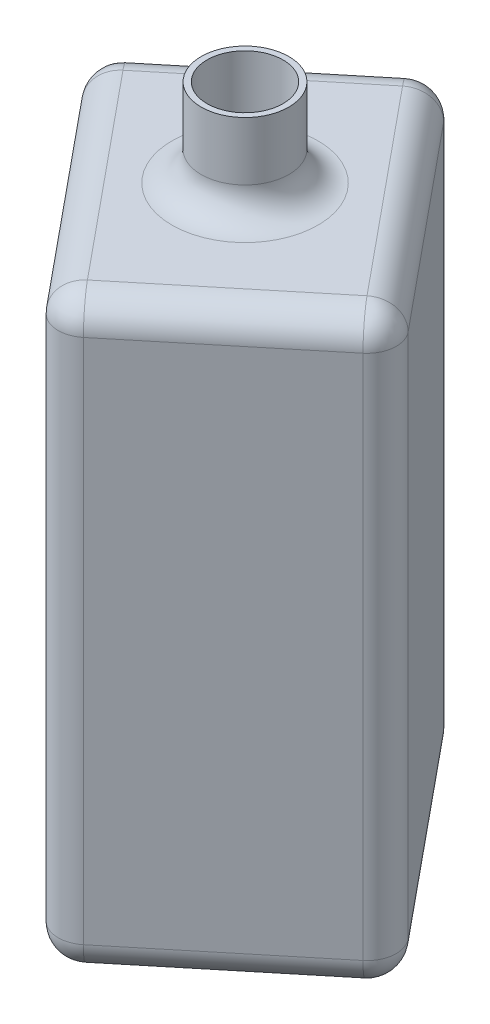
ISO-10303-21;
HEADER;
FILE_DESCRIPTION(('STEP AP214'),'2;1');
FILE_NAME('part.step','',(''),(''),'','','');
FILE_SCHEMA(('AUTOMOTIVE_DESIGN { 1 0 10303 214 1 1 1 1 }'));
ENDSEC;
DATA;
#1=APPLICATION_CONTEXT('core data for automotive mechanical design processes');
#2=APPLICATION_PROTOCOL_DEFINITION('international standard','automotive_design',2000,#1);
#3=PRODUCT_CONTEXT('',#1,'mechanical');
#4=PRODUCT('Part','Part','',(#3));
#5=PRODUCT_RELATED_PRODUCT_CATEGORY('part','',(#4));
#6=PRODUCT_DEFINITION_FORMATION('','',#4);
#7=PRODUCT_DEFINITION_CONTEXT('part definition',#1,'design');
#8=PRODUCT_DEFINITION('design','',#6,#7);
#9=PRODUCT_DEFINITION_SHAPE('','',#8);
#10=(LENGTH_UNIT() NAMED_UNIT(*) SI_UNIT(.MILLI.,.METRE.));
#11=(NAMED_UNIT(*) PLANE_ANGLE_UNIT() SI_UNIT($,.RADIAN.));
#12=(NAMED_UNIT(*) SI_UNIT($,.STERADIAN.) SOLID_ANGLE_UNIT());
#13=UNCERTAINTY_MEASURE_WITH_UNIT(LENGTH_MEASURE(1.E-05),#10,'distance_accuracy_value','');
#14=(GEOMETRIC_REPRESENTATION_CONTEXT(3) GLOBAL_UNCERTAINTY_ASSIGNED_CONTEXT((#13)) GLOBAL_UNIT_ASSIGNED_CONTEXT((#10,
#11,#12)) REPRESENTATION_CONTEXT('',''));
#15=CARTESIAN_POINT('',(0.,0.,0.));
#16=DIRECTION('',(0.,0.,1.));
#17=DIRECTION('',(1.,0.,0.));
#18=AXIS2_PLACEMENT_3D('',#15,#16,#17);
#19=CARTESIAN_POINT('',(0.,210.,0.));
#20=DIRECTION('',(0.,1.,0.));
#21=DIRECTION('',(0.,0.,1.));
#22=AXIS2_PLACEMENT_3D('',#19,#20,#21);
#23=TOROIDAL_SURFACE('',#22,25.,10.);
#24=CARTESIAN_POINT('',(0.,210.,0.));
#25=DIRECTION('',(0.,1.,0.));
#26=DIRECTION('',(0.,0.,1.));
#27=AXIS2_PLACEMENT_3D('',#24,#25,#26);
#28=CIRCLE('',#27,15.);
#29=CARTESIAN_POINT('',(0.,210.,15.));
#30=VERTEX_POINT('',#29);
#31=EDGE_CURVE('E193',#30,#30,#28,.T.);
#32=ORIENTED_EDGE('',*,*,#31,.F.);
#33=EDGE_LOOP('',(#32));
#34=FACE_BOUND('',#33,.T.);
#35=CARTESIAN_POINT('',(0.,200.,0.));
#36=DIRECTION('',(0.,1.,0.));
#37=DIRECTION('',(0.,0.,1.));
#38=AXIS2_PLACEMENT_3D('',#35,#36,#37);
#39=CIRCLE('',#38,25.);
#40=CARTESIAN_POINT('',(0.,200.,25.));
#41=VERTEX_POINT('',#40);
#42=EDGE_CURVE('E201',#41,#41,#39,.F.);
#43=ORIENTED_EDGE('',*,*,#42,.F.);
#44=EDGE_LOOP('',(#43));
#45=FACE_BOUND('',#44,.T.);
#46=ADVANCED_FACE('F52',(#34,#45),#23,.F.);
#47=CARTESIAN_POINT('',(0.,200.,0.));
#48=DIRECTION('',(0.,1.,0.));
#49=DIRECTION('',(0.,0.,1.));
#50=AXIS2_PLACEMENT_3D('',#47,#48,#49);
#51=PLANE('',#50);
#52=DIRECTION('',(0.634919137830926,0.,0.772578596918161));
#53=VECTOR('',#52,1.);
#54=CARTESIAN_POINT('',(8.13213694383848,200.,63.438433055451));
#55=LINE('',#54,#53);
#56=CARTESIAN_POINT('',(-54.3114300765985,200.,-12.5437834517178));
#57=VERTEX_POINT('',#56);
#58=CARTESIAN_POINT('',(1.78294556552921,200.,55.7126470862694));
#59=VERTEX_POINT('',#58);
#60=EDGE_CURVE('E62',#57,#59,#55,.T.);
#61=ORIENTED_EDGE('',*,*,#60,.T.);
#62=DIRECTION('',(0.772578596918161,0.,-0.634919137830925));
#63=VECTOR('',#62,1.);
#64=CARTESIAN_POINT('',(62.0372160457801,200.,6.19459207340861));
#65=LINE('',#64,#63);
#66=CARTESIAN_POINT('',(54.3114300765985,200.,12.5437834517179));
#67=VERTEX_POINT('',#66);
#68=EDGE_CURVE('E11',#59,#67,#65,.T.);
#69=ORIENTED_EDGE('',*,*,#68,.T.);
#70=DIRECTION('',(-0.634919137830926,0.,-0.772578596918161));
#71=VECTOR('',#70,1.);
#72=CARTESIAN_POINT('',(-8.13213694383851,200.,-63.438433055451));
#73=LINE('',#72,#71);
#74=CARTESIAN_POINT('',(-1.78294556552925,200.,-55.7126470862694));
#75=VERTEX_POINT('',#74);
#76=EDGE_CURVE('E249',#67,#75,#73,.T.);
#77=ORIENTED_EDGE('',*,*,#76,.T.);
#78=DIRECTION('',(-0.772578596918161,0.,0.634919137830926));
#79=VECTOR('',#78,1.);
#80=CARTESIAN_POINT('',(-62.0372160457801,200.,-6.19459207340857));
#81=LINE('',#80,#79);
#82=EDGE_CURVE('E73',#75,#57,#81,.T.);
#83=ORIENTED_EDGE('',*,*,#82,.T.);
#84=EDGE_LOOP('',(#61,#69,#77,#83));
#85=FACE_BOUND('',#84,.T.);
#86=ORIENTED_EDGE('',*,*,#42,.T.);
#87=EDGE_LOOP('',(#86));
#88=FACE_BOUND('',#87,.T.);
#89=ADVANCED_FACE('F369',(#85,#88),#51,.T.);
#90=CARTESIAN_POINT('',(0.,0.,0.));
#91=DIRECTION('',(0.,1.,0.));
#92=DIRECTION('',(0.,0.,1.));
#93=AXIS2_PLACEMENT_3D('',#90,#91,#92);
#94=PLANE('',#93);
#95=DIRECTION('',(0.772578596918161,0.,-0.634919137830925));
#96=VECTOR('',#95,1.);
#97=CARTESIAN_POINT('',(28.0471878210639,0.,34.1282152689936));
#98=LINE('',#97,#96);
#99=CARTESIAN_POINT('',(54.3114300765985,0.,12.5437834517179));
#100=VERTEX_POINT('',#99);
#101=CARTESIAN_POINT('',(1.78294556552923,0.,55.7126470862694));
#102=VERTEX_POINT('',#101);
#103=EDGE_CURVE('E215',#100,#102,#98,.F.);
#104=ORIENTED_EDGE('',*,*,#103,.T.);
#105=DIRECTION('',(0.634919137830926,0.,0.772578596918161));
#106=VECTOR('',#105,1.);
#107=CARTESIAN_POINT('',(-26.2642422555347,0.,21.5844318172758));
#108=LINE('',#107,#106);
#109=CARTESIAN_POINT('',(-54.3114300765985,0.,-12.5437834517178));
#110=VERTEX_POINT('',#109);
#111=EDGE_CURVE('E219',#102,#110,#108,.F.);
#112=ORIENTED_EDGE('',*,*,#111,.T.);
#113=DIRECTION('',(-0.772578596918161,0.,0.634919137830926));
#114=VECTOR('',#113,1.);
#115=CARTESIAN_POINT('',(-28.0471878210639,0.,-34.1282152689936));
#116=LINE('',#115,#114);
#117=CARTESIAN_POINT('',(-1.78294556552925,0.,-55.7126470862694));
#118=VERTEX_POINT('',#117);
#119=EDGE_CURVE('E217',#110,#118,#116,.F.);
#120=ORIENTED_EDGE('',*,*,#119,.T.);
#121=DIRECTION('',(-0.634919137830926,0.,-0.772578596918161));
#122=VECTOR('',#121,1.);
#123=CARTESIAN_POINT('',(26.2642422555346,0.,-21.5844318172758));
#124=LINE('',#123,#122);
#125=EDGE_CURVE('E213',#118,#100,#124,.F.);
#126=ORIENTED_EDGE('',*,*,#125,.T.);
#127=EDGE_LOOP('',(#104,#112,#120,#126));
#128=FACE_BOUND('',#127,.T.);
#129=ADVANCED_FACE('F372',(#128),#94,.F.);
#130=CARTESIAN_POINT('',(68.3864074240894,200.,13.9203780425902));
#131=DIRECTION('',(-0.772578596918161,0.,0.634919137830926));
#132=DIRECTION('',(0.634919137830926,0.,0.772578596918161));
#133=AXIS2_PLACEMENT_3D('',#130,#131,#132);
#134=PLANE('',#133);
#135=DIRECTION('',(0.,-1.,0.));
#136=VECTOR('',#135,1.);
#137=CARTESIAN_POINT('',(62.0372160457801,200.,6.19459207340861));
#138=LINE('',#137,#136);
#139=CARTESIAN_POINT('',(62.0372160457801,190.,6.19459207340861));
#140=VERTEX_POINT('',#139);
#141=CARTESIAN_POINT('',(62.0372160457801,10.,6.19459207340861));
#142=VERTEX_POINT('',#141);
#143=EDGE_CURVE('E244',#140,#142,#138,.T.);
#144=ORIENTED_EDGE('',*,*,#143,.T.);
#145=DIRECTION('',(-0.634919137830926,0.,-0.772578596918161));
#146=VECTOR('',#145,1.);
#147=CARTESIAN_POINT('',(68.3864074240894,10.,13.9203780425902));
#148=LINE('',#147,#146);
#149=CARTESIAN_POINT('',(5.94284040365236,10.,-62.0618384645786));
#150=VERTEX_POINT('',#149);
#151=EDGE_CURVE('E247',#142,#150,#148,.T.);
#152=ORIENTED_EDGE('',*,*,#151,.T.);
#153=DIRECTION('',(0.,-1.,0.));
#154=VECTOR('',#153,1.);
#155=CARTESIAN_POINT('',(5.94284040365237,200.,-62.0618384645786));
#156=LINE('',#155,#154);
#157=CARTESIAN_POINT('',(5.94284040365236,190.,-62.0618384645786));
#158=VERTEX_POINT('',#157);
#159=EDGE_CURVE('E242',#150,#158,#156,.F.);
#160=ORIENTED_EDGE('',*,*,#159,.T.);
#161=DIRECTION('',(-0.634919137830926,0.,-0.772578596918161));
#162=VECTOR('',#161,1.);
#163=CARTESIAN_POINT('',(68.3864074240894,190.,13.9203780425902));
#164=LINE('',#163,#162);
#165=EDGE_CURVE('E240',#158,#140,#164,.F.);
#166=ORIENTED_EDGE('',*,*,#165,.T.);
#167=EDGE_LOOP('',(#144,#152,#160,#166));
#168=FACE_BOUND('',#167,.T.);
#169=ADVANCED_FACE('F376',(#168),#134,.F.);
#170=CARTESIAN_POINT('',(-0.406350974656892,200.,-69.7876244337603));
#171=DIRECTION('',(0.634919137830926,0.,0.772578596918161));
#172=DIRECTION('',(0.772578596918161,0.,-0.634919137830926));
#173=AXIS2_PLACEMENT_3D('',#170,#171,#172);
#174=PLANE('',#173);
#175=DIRECTION('',(-0.772578596918161,0.,0.634919137830926));
#176=VECTOR('',#175,1.);
#177=CARTESIAN_POINT('',(-0.406350974656892,10.,-69.7876244337603));
#178=LINE('',#177,#176);
#179=CARTESIAN_POINT('',(-8.13213694383851,10.,-63.438433055451));
#180=VERTEX_POINT('',#179);
#181=CARTESIAN_POINT('',(-60.6606214549078,10.,-20.2695694208994));
#182=VERTEX_POINT('',#181);
#183=EDGE_CURVE('E226',#180,#182,#178,.T.);
#184=ORIENTED_EDGE('',*,*,#183,.T.);
#185=DIRECTION('',(0.,-1.,0.));
#186=VECTOR('',#185,1.);
#187=CARTESIAN_POINT('',(-60.6606214549078,200.,-20.2695694208995));
#188=LINE('',#187,#186);
#189=CARTESIAN_POINT('',(-60.6606214549078,190.,-20.2695694208994));
#190=VERTEX_POINT('',#189);
#191=EDGE_CURVE('E228',#182,#190,#188,.F.);
#192=ORIENTED_EDGE('',*,*,#191,.T.);
#193=DIRECTION('',(-0.772578596918161,0.,0.634919137830926));
#194=VECTOR('',#193,1.);
#195=CARTESIAN_POINT('',(-0.406350974656879,190.,-69.7876244337603));
#196=LINE('',#195,#194);
#197=CARTESIAN_POINT('',(-8.13213694383851,190.,-63.438433055451));
#198=VERTEX_POINT('',#197);
#199=EDGE_CURVE('E222',#190,#198,#196,.F.);
#200=ORIENTED_EDGE('',*,*,#199,.T.);
#201=DIRECTION('',(0.,-1.,0.));
#202=VECTOR('',#201,1.);
#203=CARTESIAN_POINT('',(-8.13213694383851,200.,-63.438433055451));
#204=LINE('',#203,#202);
#205=EDGE_CURVE('E224',#198,#180,#204,.T.);
#206=ORIENTED_EDGE('',*,*,#205,.T.);
#207=EDGE_LOOP('',(#184,#192,#200,#206));
#208=FACE_BOUND('',#207,.T.);
#209=ADVANCED_FACE('F386',(#208),#174,.F.);
#210=CARTESIAN_POINT('',(0.406350974656876,200.,69.7876244337603));
#211=DIRECTION('',(0.772578596918161,0.,-0.634919137830925));
#212=DIRECTION('',(-0.634919137830926,0.,-0.772578596918161));
#213=AXIS2_PLACEMENT_3D('',#210,#211,#212);
#214=PLANE('',#213);
#215=DIRECTION('',(0.,-1.,0.));
#216=VECTOR('',#215,1.);
#217=CARTESIAN_POINT('',(-62.0372160457801,200.,-6.19459207340861));
#218=LINE('',#217,#216);
#219=CARTESIAN_POINT('',(-62.0372160457801,190.,-6.19459207340859));
#220=VERTEX_POINT('',#219);
#221=CARTESIAN_POINT('',(-62.0372160457801,10.,-6.19459207340859));
#222=VERTEX_POINT('',#221);
#223=EDGE_CURVE('E208',#220,#222,#218,.T.);
#224=ORIENTED_EDGE('',*,*,#223,.T.);
#225=DIRECTION('',(0.634919137830926,0.,0.772578596918161));
#226=VECTOR('',#225,1.);
#227=CARTESIAN_POINT('',(0.406350974656876,10.,69.7876244337603));
#228=LINE('',#227,#226);
#229=CARTESIAN_POINT('',(-5.94284040365238,10.,62.0618384645787));
#230=VERTEX_POINT('',#229);
#231=EDGE_CURVE('E210',#222,#230,#228,.T.);
#232=ORIENTED_EDGE('',*,*,#231,.T.);
#233=DIRECTION('',(0.,-1.,0.));
#234=VECTOR('',#233,1.);
#235=CARTESIAN_POINT('',(-5.94284040365238,200.,62.0618384645787));
#236=LINE('',#235,#234);
#237=CARTESIAN_POINT('',(-5.94284040365238,190.,62.0618384645787));
#238=VERTEX_POINT('',#237);
#239=EDGE_CURVE('E206',#230,#238,#236,.F.);
#240=ORIENTED_EDGE('',*,*,#239,.T.);
#241=DIRECTION('',(0.634919137830926,0.,0.772578596918161));
#242=VECTOR('',#241,1.);
#243=CARTESIAN_POINT('',(-68.3864074240894,190.,-13.9203780425902));
#244=LINE('',#243,#242);
#245=EDGE_CURVE('E204',#238,#220,#244,.F.);
#246=ORIENTED_EDGE('',*,*,#245,.T.);
#247=EDGE_LOOP('',(#224,#232,#240,#246));
#248=FACE_BOUND('',#247,.T.);
#249=ADVANCED_FACE('F382',(#248),#214,.F.);
#250=CARTESIAN_POINT('',(68.3864074240894,200.,13.9203780425902));
#251=DIRECTION('',(-0.634919137830925,0.,-0.772578596918161));
#252=DIRECTION('',(-0.772578596918161,0.,0.634919137830925));
#253=AXIS2_PLACEMENT_3D('',#250,#251,#252);
#254=PLANE('',#253);
#255=DIRECTION('',(0.772578596918161,0.,-0.634919137830925));
#256=VECTOR('',#255,1.);
#257=CARTESIAN_POINT('',(0.406350974656869,190.,69.7876244337603));
#258=LINE('',#257,#256);
#259=CARTESIAN_POINT('',(60.6606214549078,190.,20.2695694208995));
#260=VERTEX_POINT('',#259);
#261=CARTESIAN_POINT('',(8.13213694383847,190.,63.438433055451));
#262=VERTEX_POINT('',#261);
#263=EDGE_CURVE('E231',#260,#262,#258,.F.);
#264=ORIENTED_EDGE('',*,*,#263,.T.);
#265=DIRECTION('',(0.,-1.,0.));
#266=VECTOR('',#265,1.);
#267=CARTESIAN_POINT('',(8.13213694383847,200.,63.438433055451));
#268=LINE('',#267,#266);
#269=CARTESIAN_POINT('',(8.13213694383847,10.,63.438433055451));
#270=VERTEX_POINT('',#269);
#271=EDGE_CURVE('E237',#262,#270,#268,.T.);
#272=ORIENTED_EDGE('',*,*,#271,.T.);
#273=DIRECTION('',(0.772578596918161,0.,-0.634919137830925));
#274=VECTOR('',#273,1.);
#275=CARTESIAN_POINT('',(68.3864074240894,10.,13.9203780425902));
#276=LINE('',#275,#274);
#277=CARTESIAN_POINT('',(60.6606214549078,10.,20.2695694208995));
#278=VERTEX_POINT('',#277);
#279=EDGE_CURVE('E235',#270,#278,#276,.T.);
#280=ORIENTED_EDGE('',*,*,#279,.T.);
#281=DIRECTION('',(0.,-1.,0.));
#282=VECTOR('',#281,1.);
#283=CARTESIAN_POINT('',(60.6606214549078,200.,20.2695694208995));
#284=LINE('',#283,#282);
#285=EDGE_CURVE('E233',#278,#260,#284,.F.);
#286=ORIENTED_EDGE('',*,*,#285,.T.);
#287=EDGE_LOOP('',(#264,#272,#280,#286));
#288=FACE_BOUND('',#287,.T.);
#289=ADVANCED_FACE('F378',(#288),#254,.F.);
#290=CARTESIAN_POINT('',(0.,230.,0.));
#291=DIRECTION('',(0.,1.,0.));
#292=DIRECTION('',(0.,0.,1.));
#293=AXIS2_PLACEMENT_3D('',#290,#291,#292);
#294=PLANE('',#293);
#295=CARTESIAN_POINT('',(0.,230.,0.));
#296=DIRECTION('',(0.,1.,0.));
#297=DIRECTION('',(0.,0.,1.));
#298=AXIS2_PLACEMENT_3D('',#295,#296,#297);
#299=CIRCLE('',#298,15.);
#300=CARTESIAN_POINT('',(0.,230.,15.));
#301=VERTEX_POINT('',#300);
#302=EDGE_CURVE('E185',#301,#301,#299,.T.);
#303=ORIENTED_EDGE('',*,*,#302,.T.);
#304=EDGE_LOOP('',(#303));
#305=FACE_BOUND('',#304,.T.);
#306=CARTESIAN_POINT('',(0.,230.,0.));
#307=DIRECTION('',(0.,1.,0.));
#308=DIRECTION('',(0.,0.,1.));
#309=AXIS2_PLACEMENT_3D('',#306,#307,#308);
#310=CIRCLE('',#309,13.);
#311=CARTESIAN_POINT('',(0.,230.,13.));
#312=VERTEX_POINT('',#311);
#313=EDGE_CURVE('E320',#312,#312,#310,.T.);
#314=ORIENTED_EDGE('',*,*,#313,.F.);
#315=EDGE_LOOP('',(#314));
#316=FACE_BOUND('',#315,.T.);
#317=ADVANCED_FACE('F381',(#305,#316),#294,.T.);
#318=CARTESIAN_POINT('',(0.,230.,0.));
#319=DIRECTION('',(0.,-1.,0.));
#320=DIRECTION('',(0.,0.,-1.));
#321=AXIS2_PLACEMENT_3D('',#318,#319,#320);
#322=CYLINDRICAL_SURFACE('',#321,15.);
#323=ORIENTED_EDGE('',*,*,#31,.T.);
#324=EDGE_LOOP('',(#323));
#325=FACE_BOUND('',#324,.T.);
#326=ORIENTED_EDGE('',*,*,#302,.F.);
#327=EDGE_LOOP('',(#326));
#328=FACE_BOUND('',#327,.T.);
#329=ADVANCED_FACE('F524',(#325,#328),#322,.T.);
#330=CARTESIAN_POINT('',(0.,230.,0.));
#331=DIRECTION('',(0.,-1.,0.));
#332=DIRECTION('',(0.,0.,-1.));
#333=AXIS2_PLACEMENT_3D('',#330,#331,#332);
#334=CYLINDRICAL_SURFACE('',#333,13.);
#335=ORIENTED_EDGE('',*,*,#313,.T.);
#336=EDGE_LOOP('',(#335));
#337=FACE_BOUND('',#336,.T.);
#338=CARTESIAN_POINT('',(0.,200.,0.));
#339=DIRECTION('',(0.,1.,0.));
#340=DIRECTION('',(0.,0.,1.));
#341=AXIS2_PLACEMENT_3D('',#338,#339,#340);
#342=CIRCLE('',#341,13.);
#343=CARTESIAN_POINT('',(0.,200.,13.));
#344=VERTEX_POINT('',#343);
#345=EDGE_CURVE('E190',#344,#344,#342,.F.);
#346=ORIENTED_EDGE('',*,*,#345,.T.);
#347=EDGE_LOOP('',(#346));
#348=FACE_BOUND('',#347,.T.);
#349=ADVANCED_FACE('F518',(#337,#348),#334,.F.);
#350=ORIENTED_EDGE('',*,*,#345,.F.);
#351=EDGE_LOOP('',(#350));
#352=FACE_BOUND('',#351,.T.);
#353=ADVANCED_FACE('F373',(#352),#51,.T.);
#354=CARTESIAN_POINT('',(26.2642422555346,190.,-21.5844318172758));
#355=DIRECTION('',(0.634919137830926,0.,0.772578596918161));
#356=DIRECTION('',(0.772578596918161,0.,-0.634919137830926));
#357=AXIS2_PLACEMENT_3D('',#354,#355,#356);
#358=CYLINDRICAL_SURFACE('',#357,10.);
#359=CARTESIAN_POINT('',(-1.78294556552925,190.,-55.7126470862694));
#360=DIRECTION('',(-0.634919137830925,0.,-0.772578596918161));
#361=DIRECTION('',(-0.772578596918161,0.,0.634919137830925));
#362=AXIS2_PLACEMENT_3D('',#359,#360,#361);
#363=CIRCLE('',#362,10.);
#364=EDGE_CURVE('E56',#75,#158,#363,.T.);
#365=ORIENTED_EDGE('',*,*,#364,.F.);
#366=ORIENTED_EDGE('',*,*,#76,.F.);
#367=CARTESIAN_POINT('',(54.3114300765985,190.,12.5437834517179));
#368=DIRECTION('',(0.634919137830926,0.,0.772578596918161));
#369=DIRECTION('',(0.772578596918161,0.,-0.634919137830926));
#370=AXIS2_PLACEMENT_3D('',#367,#368,#369);
#371=CIRCLE('',#370,10.);
#372=EDGE_CURVE('E312',#140,#67,#371,.T.);
#373=ORIENTED_EDGE('',*,*,#372,.F.);
#374=ORIENTED_EDGE('',*,*,#165,.F.);
#375=EDGE_LOOP('',(#365,#366,#373,#374));
#376=FACE_BOUND('',#375,.T.);
#377=ADVANCED_FACE('F54',(#376),#358,.T.);
#378=CARTESIAN_POINT('',(-1.78294556552925,190.,-55.7126470862694));
#379=DIRECTION('',(0.772578596918161,0.,-0.634919137830926));
#380=DIRECTION('',(-0.634919137830926,0.,-0.772578596918161));
#381=AXIS2_PLACEMENT_3D('',#378,#379,#380);
#382=SPHERICAL_SURFACE('',#381,10.);
#383=CARTESIAN_POINT('',(-1.78294556552925,190.,-55.7126470862694));
#384=DIRECTION('',(0.772578596918161,0.,-0.634919137830926));
#385=DIRECTION('',(-0.634919137830926,0.,-0.772578596918161));
#386=AXIS2_PLACEMENT_3D('',#383,#384,#385);
#387=CIRCLE('',#386,10.);
#388=EDGE_CURVE('E307',#75,#198,#387,.F.);
#389=ORIENTED_EDGE('',*,*,#388,.F.);
#390=ORIENTED_EDGE('',*,*,#364,.T.);
#391=CARTESIAN_POINT('',(-1.78294556552925,190.,-55.7126470862694));
#392=DIRECTION('',(0.,1.,0.));
#393=DIRECTION('',(0.,0.,1.));
#394=AXIS2_PLACEMENT_3D('',#391,#392,#393);
#395=CIRCLE('',#394,10.);
#396=EDGE_CURVE('E310',#198,#158,#395,.F.);
#397=ORIENTED_EDGE('',*,*,#396,.F.);
#398=EDGE_LOOP('',(#389,#390,#397));
#399=FACE_BOUND('',#398,.T.);
#400=ADVANCED_FACE('F467',(#399),#382,.T.);
#401=CARTESIAN_POINT('',(54.3114300765985,190.,12.5437834517179));
#402=DIRECTION('',(0.,1.,0.));
#403=DIRECTION('',(-1.,0.,0.));
#404=AXIS2_PLACEMENT_3D('',#401,#402,#403);
#405=SPHERICAL_SURFACE('',#404,10.);
#406=CARTESIAN_POINT('',(54.3114300765985,190.,12.5437834517179));
#407=DIRECTION('',(0.,1.,0.));
#408=DIRECTION('',(0.,0.,1.));
#409=AXIS2_PLACEMENT_3D('',#406,#407,#408);
#410=CIRCLE('',#409,10.);
#411=EDGE_CURVE('E302',#140,#260,#410,.F.);
#412=ORIENTED_EDGE('',*,*,#411,.F.);
#413=ORIENTED_EDGE('',*,*,#372,.T.);
#414=CARTESIAN_POINT('',(54.3114300765985,190.,12.5437834517179));
#415=DIRECTION('',(0.772578596918161,0.,-0.634919137830925));
#416=DIRECTION('',(-0.634919137830925,0.,-0.772578596918161));
#417=AXIS2_PLACEMENT_3D('',#414,#415,#416);
#418=CIRCLE('',#417,10.);
#419=EDGE_CURVE('E305',#260,#67,#418,.F.);
#420=ORIENTED_EDGE('',*,*,#419,.F.);
#421=EDGE_LOOP('',(#412,#413,#420));
#422=FACE_BOUND('',#421,.T.);
#423=ADVANCED_FACE('F464',(#422),#405,.T.);
#424=CARTESIAN_POINT('',(-1.78294556552925,200.,-55.7126470862694));
#425=DIRECTION('',(0.,-1.,0.));
#426=DIRECTION('',(0.,0.,-1.));
#427=AXIS2_PLACEMENT_3D('',#424,#425,#426);
#428=CYLINDRICAL_SURFACE('',#427,10.);
#429=ORIENTED_EDGE('',*,*,#396,.T.);
#430=ORIENTED_EDGE('',*,*,#159,.F.);
#431=CARTESIAN_POINT('',(-1.78294556552925,10.,-55.7126470862694));
#432=DIRECTION('',(0.,-1.,0.));
#433=DIRECTION('',(0.,0.,-1.));
#434=AXIS2_PLACEMENT_3D('',#431,#432,#433);
#435=CIRCLE('',#434,10.);
#436=EDGE_CURVE('E296',#180,#150,#435,.T.);
#437=ORIENTED_EDGE('',*,*,#436,.F.);
#438=ORIENTED_EDGE('',*,*,#205,.F.);
#439=EDGE_LOOP('',(#429,#430,#437,#438));
#440=FACE_BOUND('',#439,.T.);
#441=ADVANCED_FACE('F460',(#440),#428,.T.);
#442=CARTESIAN_POINT('',(-28.0471878210639,190.,-34.1282152689936));
#443=DIRECTION('',(0.772578596918161,0.,-0.634919137830926));
#444=DIRECTION('',(-0.634919137830926,0.,-0.772578596918161));
#445=AXIS2_PLACEMENT_3D('',#442,#443,#444);
#446=CYLINDRICAL_SURFACE('',#445,10.);
#447=ORIENTED_EDGE('',*,*,#388,.T.);
#448=ORIENTED_EDGE('',*,*,#199,.F.);
#449=CARTESIAN_POINT('',(-54.3114300765985,190.,-12.5437834517178));
#450=DIRECTION('',(-0.772578596918162,0.,0.634919137830924));
#451=DIRECTION('',(0.634919137830924,0.,0.772578596918162));
#452=AXIS2_PLACEMENT_3D('',#449,#450,#451);
#453=CIRCLE('',#452,10.);
#454=EDGE_CURVE('E293',#57,#190,#453,.T.);
#455=ORIENTED_EDGE('',*,*,#454,.F.);
#456=ORIENTED_EDGE('',*,*,#82,.F.);
#457=EDGE_LOOP('',(#447,#448,#455,#456));
#458=FACE_BOUND('',#457,.T.);
#459=ADVANCED_FACE('F456',(#458),#446,.T.);
#460=CARTESIAN_POINT('',(-26.2642422555347,190.,21.5844318172758));
#461=DIRECTION('',(-0.634919137830926,0.,-0.772578596918161));
#462=DIRECTION('',(-0.772578596918161,0.,0.634919137830925));
#463=AXIS2_PLACEMENT_3D('',#460,#461,#462);
#464=CYLINDRICAL_SURFACE('',#463,10.);
#465=CARTESIAN_POINT('',(1.78294556552921,190.,55.7126470862694));
#466=DIRECTION('',(0.634919137830925,0.,0.772578596918161));
#467=DIRECTION('',(0.772578596918161,0.,-0.634919137830926));
#468=AXIS2_PLACEMENT_3D('',#465,#466,#467);
#469=CIRCLE('',#468,10.);
#470=EDGE_CURVE('E287',#59,#238,#469,.T.);
#471=ORIENTED_EDGE('',*,*,#470,.F.);
#472=ORIENTED_EDGE('',*,*,#60,.F.);
#473=CARTESIAN_POINT('',(-54.3114300765985,190.,-12.5437834517179));
#474=DIRECTION('',(-0.634919137830925,0.,-0.772578596918161));
#475=DIRECTION('',(-0.772578596918161,0.,0.634919137830926));
#476=AXIS2_PLACEMENT_3D('',#473,#474,#475);
#477=CIRCLE('',#476,10.);
#478=EDGE_CURVE('E290',#220,#57,#477,.T.);
#479=ORIENTED_EDGE('',*,*,#478,.F.);
#480=ORIENTED_EDGE('',*,*,#245,.F.);
#481=EDGE_LOOP('',(#471,#472,#479,#480));
#482=FACE_BOUND('',#481,.T.);
#483=ADVANCED_FACE('F452',(#482),#464,.T.);
#484=CARTESIAN_POINT('',(28.0471878210639,190.,34.1282152689936));
#485=DIRECTION('',(-0.772578596918161,0.,0.634919137830925));
#486=DIRECTION('',(0.634919137830925,0.,0.772578596918161));
#487=AXIS2_PLACEMENT_3D('',#484,#485,#486);
#488=CYLINDRICAL_SURFACE('',#487,10.);
#489=ORIENTED_EDGE('',*,*,#419,.T.);
#490=ORIENTED_EDGE('',*,*,#68,.F.);
#491=CARTESIAN_POINT('',(1.78294556552922,190.,55.7126470862694));
#492=DIRECTION('',(-0.772578596918161,0.,0.634919137830925));
#493=DIRECTION('',(0.634919137830926,0.,0.772578596918161));
#494=AXIS2_PLACEMENT_3D('',#491,#492,#493);
#495=CIRCLE('',#494,10.);
#496=EDGE_CURVE('E284',#262,#59,#495,.T.);
#497=ORIENTED_EDGE('',*,*,#496,.F.);
#498=ORIENTED_EDGE('',*,*,#263,.F.);
#499=EDGE_LOOP('',(#489,#490,#497,#498));
#500=FACE_BOUND('',#499,.T.);
#501=ADVANCED_FACE('F448',(#500),#488,.T.);
#502=CARTESIAN_POINT('',(54.3114300765985,200.,12.5437834517179));
#503=DIRECTION('',(0.,-1.,0.));
#504=DIRECTION('',(0.,0.,-1.));
#505=AXIS2_PLACEMENT_3D('',#502,#503,#504);
#506=CYLINDRICAL_SURFACE('',#505,10.);
#507=ORIENTED_EDGE('',*,*,#411,.T.);
#508=ORIENTED_EDGE('',*,*,#285,.F.);
#509=CARTESIAN_POINT('',(54.3114300765985,10.,12.5437834517179));
#510=DIRECTION('',(0.,-1.,0.));
#511=DIRECTION('',(0.,0.,-1.));
#512=AXIS2_PLACEMENT_3D('',#509,#510,#511);
#513=CIRCLE('',#512,10.);
#514=EDGE_CURVE('E281',#142,#278,#513,.T.);
#515=ORIENTED_EDGE('',*,*,#514,.F.);
#516=ORIENTED_EDGE('',*,*,#143,.F.);
#517=EDGE_LOOP('',(#507,#508,#515,#516));
#518=FACE_BOUND('',#517,.T.);
#519=ADVANCED_FACE('F444',(#518),#506,.T.);
#520=CARTESIAN_POINT('',(60.6606214549078,10.,20.2695694208995));
#521=DIRECTION('',(-0.634919137830926,0.,-0.772578596918161));
#522=DIRECTION('',(-0.772578596918161,0.,0.634919137830926));
#523=AXIS2_PLACEMENT_3D('',#520,#521,#522);
#524=CYLINDRICAL_SURFACE('',#523,10.);
#525=CARTESIAN_POINT('',(-1.78294556552925,10.,-55.7126470862694));
#526=DIRECTION('',(-0.634919137830926,0.,-0.772578596918161));
#527=DIRECTION('',(-0.772578596918161,0.,0.634919137830926));
#528=AXIS2_PLACEMENT_3D('',#525,#526,#527);
#529=CIRCLE('',#528,10.);
#530=EDGE_CURVE('E299',#150,#118,#529,.T.);
#531=ORIENTED_EDGE('',*,*,#530,.F.);
#532=ORIENTED_EDGE('',*,*,#151,.F.);
#533=CARTESIAN_POINT('',(54.3114300765985,10.,12.5437834517179));
#534=DIRECTION('',(0.634919137830927,0.,0.77257859691816));
#535=DIRECTION('',(0.77257859691816,0.,-0.634919137830927));
#536=AXIS2_PLACEMENT_3D('',#533,#534,#535);
#537=CIRCLE('',#536,10.);
#538=EDGE_CURVE('E279',#100,#142,#537,.T.);
#539=ORIENTED_EDGE('',*,*,#538,.F.);
#540=ORIENTED_EDGE('',*,*,#125,.F.);
#541=EDGE_LOOP('',(#531,#532,#539,#540));
#542=FACE_BOUND('',#541,.T.);
#543=ADVANCED_FACE('F440',(#542),#524,.T.);
#544=CARTESIAN_POINT('',(-1.78294556552925,10.,-55.7126470862694));
#545=DIRECTION('',(0.772578596918161,0.,-0.634919137830926));
#546=DIRECTION('',(-0.634919137830926,0.,-0.772578596918161));
#547=AXIS2_PLACEMENT_3D('',#544,#545,#546);
#548=SPHERICAL_SURFACE('',#547,10.);
#549=ORIENTED_EDGE('',*,*,#436,.T.);
#550=ORIENTED_EDGE('',*,*,#530,.T.);
#551=CARTESIAN_POINT('',(-1.78294556552926,10.,-55.7126470862694));
#552=DIRECTION('',(0.772578596918161,0.,-0.634919137830925));
#553=DIRECTION('',(-0.634919137830925,0.,-0.772578596918162));
#554=AXIS2_PLACEMENT_3D('',#551,#552,#553);
#555=CIRCLE('',#554,10.);
#556=EDGE_CURVE('E276',#180,#118,#555,.F.);
#557=ORIENTED_EDGE('',*,*,#556,.F.);
#558=EDGE_LOOP('',(#549,#550,#557));
#559=FACE_BOUND('',#558,.T.);
#560=ADVANCED_FACE('F436',(#559),#548,.T.);
#561=CARTESIAN_POINT('',(-54.3114300765985,190.,-12.5437834517178));
#562=DIRECTION('',(0.,1.,0.));
#563=DIRECTION('',(-1.,0.,0.));
#564=AXIS2_PLACEMENT_3D('',#561,#562,#563);
#565=SPHERICAL_SURFACE('',#564,10.);
#566=ORIENTED_EDGE('',*,*,#478,.T.);
#567=ORIENTED_EDGE('',*,*,#454,.T.);
#568=CARTESIAN_POINT('',(-54.3114300765985,190.,-12.5437834517178));
#569=DIRECTION('',(0.,1.,0.));
#570=DIRECTION('',(0.,0.,1.));
#571=AXIS2_PLACEMENT_3D('',#568,#569,#570);
#572=CIRCLE('',#571,10.);
#573=EDGE_CURVE('E274',#220,#190,#572,.F.);
#574=ORIENTED_EDGE('',*,*,#573,.F.);
#575=EDGE_LOOP('',(#566,#567,#574));
#576=FACE_BOUND('',#575,.T.);
#577=ADVANCED_FACE('F432',(#576),#565,.T.);
#578=CARTESIAN_POINT('',(1.78294556552923,190.,55.7126470862694));
#579=DIRECTION('',(0.,1.,0.));
#580=DIRECTION('',(-1.,0.,0.));
#581=AXIS2_PLACEMENT_3D('',#578,#579,#580);
#582=SPHERICAL_SURFACE('',#581,10.);
#583=ORIENTED_EDGE('',*,*,#496,.T.);
#584=ORIENTED_EDGE('',*,*,#470,.T.);
#585=CARTESIAN_POINT('',(1.78294556552923,190.,55.7126470862694));
#586=DIRECTION('',(0.,1.,0.));
#587=DIRECTION('',(0.,0.,1.));
#588=AXIS2_PLACEMENT_3D('',#585,#586,#587);
#589=CIRCLE('',#588,10.);
#590=EDGE_CURVE('E271',#262,#238,#589,.F.);
#591=ORIENTED_EDGE('',*,*,#590,.F.);
#592=EDGE_LOOP('',(#583,#584,#591));
#593=FACE_BOUND('',#592,.T.);
#594=ADVANCED_FACE('F428',(#593),#582,.T.);
#595=CARTESIAN_POINT('',(54.3114300765985,10.,12.5437834517179));
#596=DIRECTION('',(0.77257859691816,0.,-0.634919137830926));
#597=DIRECTION('',(-0.634919137830926,0.,-0.77257859691816));
#598=AXIS2_PLACEMENT_3D('',#595,#596,#597);
#599=SPHERICAL_SURFACE('',#598,10.);
#600=ORIENTED_EDGE('',*,*,#538,.T.);
#601=ORIENTED_EDGE('',*,*,#514,.T.);
#602=CARTESIAN_POINT('',(54.3114300765985,10.,12.5437834517179));
#603=DIRECTION('',(0.772578596918161,0.,-0.634919137830926));
#604=DIRECTION('',(-0.634919137830926,0.,-0.772578596918161));
#605=AXIS2_PLACEMENT_3D('',#602,#603,#604);
#606=CIRCLE('',#605,10.);
#607=EDGE_CURVE('E268',#100,#278,#606,.F.);
#608=ORIENTED_EDGE('',*,*,#607,.F.);
#609=EDGE_LOOP('',(#600,#601,#608));
#610=FACE_BOUND('',#609,.T.);
#611=ADVANCED_FACE('F424',(#610),#599,.T.);
#612=CARTESIAN_POINT('',(5.94284040365237,10.,-62.0618384645786));
#613=DIRECTION('',(-0.772578596918161,0.,0.634919137830926));
#614=DIRECTION('',(0.634919137830926,0.,0.772578596918161));
#615=AXIS2_PLACEMENT_3D('',#612,#613,#614);
#616=CYLINDRICAL_SURFACE('',#615,10.);
#617=ORIENTED_EDGE('',*,*,#556,.T.);
#618=ORIENTED_EDGE('',*,*,#119,.F.);
#619=CARTESIAN_POINT('',(-54.3114300765985,10.,-12.5437834517178));
#620=DIRECTION('',(-0.772578596918161,0.,0.634919137830926));
#621=DIRECTION('',(0.634919137830926,0.,0.772578596918161));
#622=AXIS2_PLACEMENT_3D('',#619,#620,#621);
#623=CIRCLE('',#622,10.);
#624=EDGE_CURVE('E265',#182,#110,#623,.T.);
#625=ORIENTED_EDGE('',*,*,#624,.F.);
#626=ORIENTED_EDGE('',*,*,#183,.F.);
#627=EDGE_LOOP('',(#617,#618,#625,#626));
#628=FACE_BOUND('',#627,.T.);
#629=ADVANCED_FACE('F420',(#628),#616,.T.);
#630=CARTESIAN_POINT('',(-54.3114300765985,200.,-12.5437834517178));
#631=DIRECTION('',(0.,-1.,0.));
#632=DIRECTION('',(0.,0.,-1.));
#633=AXIS2_PLACEMENT_3D('',#630,#631,#632);
#634=CYLINDRICAL_SURFACE('',#633,10.);
#635=ORIENTED_EDGE('',*,*,#573,.T.);
#636=ORIENTED_EDGE('',*,*,#191,.F.);
#637=CARTESIAN_POINT('',(-54.3114300765985,10.,-12.5437834517179));
#638=DIRECTION('',(0.,-1.,0.));
#639=DIRECTION('',(0.,0.,-1.));
#640=AXIS2_PLACEMENT_3D('',#637,#638,#639);
#641=CIRCLE('',#640,10.);
#642=EDGE_CURVE('E262',#222,#182,#641,.T.);
#643=ORIENTED_EDGE('',*,*,#642,.F.);
#644=ORIENTED_EDGE('',*,*,#223,.F.);
#645=EDGE_LOOP('',(#635,#636,#643,#644));
#646=FACE_BOUND('',#645,.T.);
#647=ADVANCED_FACE('F416',(#646),#634,.T.);
#648=CARTESIAN_POINT('',(1.78294556552921,200.,55.7126470862694));
#649=DIRECTION('',(0.,-1.,0.));
#650=DIRECTION('',(0.,0.,-1.));
#651=AXIS2_PLACEMENT_3D('',#648,#649,#650);
#652=CYLINDRICAL_SURFACE('',#651,10.);
#653=ORIENTED_EDGE('',*,*,#590,.T.);
#654=ORIENTED_EDGE('',*,*,#239,.F.);
#655=CARTESIAN_POINT('',(1.78294556552922,10.,55.7126470862694));
#656=DIRECTION('',(0.,-1.,0.));
#657=DIRECTION('',(0.,0.,-1.));
#658=AXIS2_PLACEMENT_3D('',#655,#656,#657);
#659=CIRCLE('',#658,10.);
#660=EDGE_CURVE('E259',#270,#230,#659,.T.);
#661=ORIENTED_EDGE('',*,*,#660,.F.);
#662=ORIENTED_EDGE('',*,*,#271,.F.);
#663=EDGE_LOOP('',(#653,#654,#661,#662));
#664=FACE_BOUND('',#663,.T.);
#665=ADVANCED_FACE('F412',(#664),#652,.T.);
#666=CARTESIAN_POINT('',(62.0372160457801,10.,6.19459207340862));
#667=DIRECTION('',(0.772578596918161,0.,-0.634919137830925));
#668=DIRECTION('',(-0.634919137830925,0.,-0.772578596918161));
#669=AXIS2_PLACEMENT_3D('',#666,#667,#668);
#670=CYLINDRICAL_SURFACE('',#669,10.);
#671=ORIENTED_EDGE('',*,*,#607,.T.);
#672=ORIENTED_EDGE('',*,*,#279,.F.);
#673=CARTESIAN_POINT('',(1.78294556552923,10.,55.7126470862694));
#674=DIRECTION('',(-0.772578596918162,0.,0.634919137830924));
#675=DIRECTION('',(0.634919137830924,0.,0.772578596918162));
#676=AXIS2_PLACEMENT_3D('',#673,#674,#675);
#677=CIRCLE('',#676,10.);
#678=EDGE_CURVE('E257',#102,#270,#677,.T.);
#679=ORIENTED_EDGE('',*,*,#678,.F.);
#680=ORIENTED_EDGE('',*,*,#103,.F.);
#681=EDGE_LOOP('',(#671,#672,#679,#680));
#682=FACE_BOUND('',#681,.T.);
#683=ADVANCED_FACE('F408',(#682),#670,.T.);
#684=CARTESIAN_POINT('',(-54.3114300765985,10.,-12.5437834517178));
#685=DIRECTION('',(-0.634919137830925,0.,-0.772578596918161));
#686=DIRECTION('',(-0.772578596918161,0.,0.634919137830925));
#687=AXIS2_PLACEMENT_3D('',#684,#685,#686);
#688=SPHERICAL_SURFACE('',#687,10.);
#689=ORIENTED_EDGE('',*,*,#642,.T.);
#690=ORIENTED_EDGE('',*,*,#624,.T.);
#691=CARTESIAN_POINT('',(-54.3114300765985,10.,-12.5437834517178));
#692=DIRECTION('',(-0.634919137830924,0.,-0.772578596918162));
#693=DIRECTION('',(-0.772578596918162,0.,0.634919137830924));
#694=AXIS2_PLACEMENT_3D('',#691,#692,#693);
#695=CIRCLE('',#694,10.);
#696=EDGE_CURVE('E255',#222,#110,#695,.F.);
#697=ORIENTED_EDGE('',*,*,#696,.F.);
#698=EDGE_LOOP('',(#689,#690,#697));
#699=FACE_BOUND('',#698,.T.);
#700=ADVANCED_FACE('F404',(#699),#688,.T.);
#701=CARTESIAN_POINT('',(1.78294556552923,10.,55.7126470862694));
#702=DIRECTION('',(0.634919137830925,0.,0.772578596918162));
#703=DIRECTION('',(0.772578596918162,0.,-0.634919137830925));
#704=AXIS2_PLACEMENT_3D('',#701,#702,#703);
#705=SPHERICAL_SURFACE('',#704,10.);
#706=ORIENTED_EDGE('',*,*,#678,.T.);
#707=ORIENTED_EDGE('',*,*,#660,.T.);
#708=CARTESIAN_POINT('',(1.78294556552923,10.,55.7126470862694));
#709=DIRECTION('',(0.634919137830926,0.,0.772578596918161));
#710=DIRECTION('',(0.772578596918161,0.,-0.634919137830926));
#711=AXIS2_PLACEMENT_3D('',#708,#709,#710);
#712=CIRCLE('',#711,10.);
#713=EDGE_CURVE('E253',#102,#230,#712,.F.);
#714=ORIENTED_EDGE('',*,*,#713,.F.);
#715=EDGE_LOOP('',(#706,#707,#714));
#716=FACE_BOUND('',#715,.T.);
#717=ADVANCED_FACE('F400',(#716),#705,.T.);
#718=CARTESIAN_POINT('',(8.13213694383848,10.,63.438433055451));
#719=DIRECTION('',(0.634919137830926,0.,0.772578596918161));
#720=DIRECTION('',(0.772578596918161,0.,-0.634919137830925));
#721=AXIS2_PLACEMENT_3D('',#718,#719,#720);
#722=CYLINDRICAL_SURFACE('',#721,10.);
#723=ORIENTED_EDGE('',*,*,#696,.T.);
#724=ORIENTED_EDGE('',*,*,#111,.F.);
#725=ORIENTED_EDGE('',*,*,#713,.T.);
#726=ORIENTED_EDGE('',*,*,#231,.F.);
#727=EDGE_LOOP('',(#723,#724,#725,#726));
#728=FACE_BOUND('',#727,.T.);
#729=ADVANCED_FACE('F397',(#728),#722,.T.);
#730=CLOSED_SHELL('',(#46,#89,#129,#169,#209,#249,#289,#317,#329,#349,#353,#377,#400,#423,#441,
#459,#483,#501,#519,#543,#560,#577,#594,#611,#629,#647,#665,#683,#700,#717,#729));
#731=CARTESIAN_POINT('',(-68.3879525812832,194.59866908557,-13.9191082043145));
#732=DIRECTION('',(0.,-1.,0.));
#733=DIRECTION('',(0.,0.,-1.));
#734=AXIS2_PLACEMENT_3D('',#731,#732,#733);
#735=PLANE('',#734);
#736=DIRECTION('',(0.634919137830925,0.,0.772578596918161));
#737=VECTOR('',#736,1.);
#738=CARTESIAN_POINT('',(54.3114300765985,194.59866908557,12.5437834517179));
#739=LINE('',#738,#737);
#740=CARTESIAN_POINT('',(-1.78294556552924,194.59866908557,-55.7126470862694));
#741=VERTEX_POINT('',#740);
#742=CARTESIAN_POINT('',(54.3114300765985,194.59866908557,12.5437834517179));
#743=VERTEX_POINT('',#742);
#744=EDGE_CURVE('E184',#741,#743,#739,.T.);
#745=ORIENTED_EDGE('',*,*,#744,.T.);
#746=DIRECTION('',(-0.772578596918161,0.,0.634919137830925));
#747=VECTOR('',#746,1.);
#748=CARTESIAN_POINT('',(54.3114300765985,194.59866908557,12.5437834517179));
#749=LINE('',#748,#747);
#750=CARTESIAN_POINT('',(1.78294556552924,194.59866908557,55.7126470862694));
#751=VERTEX_POINT('',#750);
#752=EDGE_CURVE('E189',#743,#751,#749,.T.);
#753=ORIENTED_EDGE('',*,*,#752,.T.);
#754=DIRECTION('',(-0.634919137830925,0.,-0.772578596918161));
#755=VECTOR('',#754,1.);
#756=CARTESIAN_POINT('',(1.78294556552924,194.59866908557,55.7126470862694));
#757=LINE('',#756,#755);
#758=CARTESIAN_POINT('',(-54.3114300765985,194.59866908557,-12.5437834517179));
#759=VERTEX_POINT('',#758);
#760=EDGE_CURVE('E168',#751,#759,#757,.T.);
#761=ORIENTED_EDGE('',*,*,#760,.T.);
#762=DIRECTION('',(0.772578596918161,0.,-0.634919137830925));
#763=VECTOR('',#762,1.);
#764=CARTESIAN_POINT('',(-1.78294556552924,194.59866908557,-55.7126470862694));
#765=LINE('',#764,#763);
#766=EDGE_CURVE('E180',#759,#741,#765,.T.);
#767=ORIENTED_EDGE('',*,*,#766,.T.);
#768=EDGE_LOOP('',(#745,#753,#761,#767));
#769=FACE_BOUND('',#768,.T.);
#770=ADVANCED_FACE('F188',(#769),#735,.T.);
#771=CARTESIAN_POINT('',(0.404805817463022,6.42449122784114,69.7888942720359));
#772=DIRECTION('',(0.,1.,0.));
#773=DIRECTION('',(0.,0.,1.));
#774=AXIS2_PLACEMENT_3D('',#771,#772,#773);
#775=PLANE('',#774);
#776=DIRECTION('',(0.634919137830925,0.,0.772578596918161));
#777=VECTOR('',#776,1.);
#778=CARTESIAN_POINT('',(1.78294556552924,6.42449122784114,55.7126470862694));
#779=LINE('',#778,#777);
#780=CARTESIAN_POINT('',(-54.3114300765985,6.42449122784114,-12.5437834517179));
#781=VERTEX_POINT('',#780);
#782=CARTESIAN_POINT('',(1.78294556552924,6.42449122784114,55.7126470862694));
#783=VERTEX_POINT('',#782);
#784=EDGE_CURVE('E171',#781,#783,#779,.T.);
#785=ORIENTED_EDGE('',*,*,#784,.T.);
#786=DIRECTION('',(0.772578596918161,0.,-0.634919137830925));
#787=VECTOR('',#786,1.);
#788=CARTESIAN_POINT('',(54.3114300765985,6.42449122784114,12.5437834517179));
#789=LINE('',#788,#787);
#790=CARTESIAN_POINT('',(54.3114300765985,6.42449122784114,12.5437834517179));
#791=VERTEX_POINT('',#790);
#792=EDGE_CURVE('E339',#783,#791,#789,.T.);
#793=ORIENTED_EDGE('',*,*,#792,.T.);
#794=DIRECTION('',(-0.634919137830925,0.,-0.772578596918161));
#795=VECTOR('',#794,1.);
#796=CARTESIAN_POINT('',(54.3114300765985,6.42449122784114,12.5437834517179));
#797=LINE('',#796,#795);
#798=CARTESIAN_POINT('',(-1.78294556552924,6.42449122784114,-55.7126470862694));
#799=VERTEX_POINT('',#798);
#800=EDGE_CURVE('E336',#791,#799,#797,.T.);
#801=ORIENTED_EDGE('',*,*,#800,.T.);
#802=DIRECTION('',(-0.772578596918161,0.,0.634919137830925));
#803=VECTOR('',#802,1.);
#804=CARTESIAN_POINT('',(-1.78294556552924,6.42449122784114,-55.7126470862694));
#805=LINE('',#804,#803);
#806=EDGE_CURVE('E334',#799,#781,#805,.T.);
#807=ORIENTED_EDGE('',*,*,#806,.T.);
#808=EDGE_LOOP('',(#785,#793,#801,#807));
#809=FACE_BOUND('',#808,.T.);
#810=ADVANCED_FACE('F351',(#809),#775,.T.);
#811=CARTESIAN_POINT('',(1.78294556552924,200.,55.7126470862694));
#812=DIRECTION('',(0.772578596918161,0.,-0.634919137830925));
#813=DIRECTION('',(-0.634919137830925,0.,-0.772578596918161));
#814=AXIS2_PLACEMENT_3D('',#811,#812,#813);
#815=PLANE('',#814);
#816=ORIENTED_EDGE('',*,*,#760,.F.);
#817=DIRECTION('',(0.,-1.,0.));
#818=VECTOR('',#817,1.);
#819=CARTESIAN_POINT('',(1.78294556552924,200.,55.7126470862694));
#820=LINE('',#819,#818);
#821=EDGE_CURVE('E176',#751,#783,#820,.T.);
#822=ORIENTED_EDGE('',*,*,#821,.T.);
#823=ORIENTED_EDGE('',*,*,#784,.F.);
#824=DIRECTION('',(0.,-1.,0.));
#825=VECTOR('',#824,1.);
#826=CARTESIAN_POINT('',(-54.3114300765985,200.,-12.5437834517179));
#827=LINE('',#826,#825);
#828=EDGE_CURVE('E164',#759,#781,#827,.T.);
#829=ORIENTED_EDGE('',*,*,#828,.F.);
#830=EDGE_LOOP('',(#816,#822,#823,#829));
#831=FACE_BOUND('',#830,.T.);
#832=ADVANCED_FACE('F166',(#831),#815,.T.);
#833=CARTESIAN_POINT('',(-1.78294556552924,200.,-55.7126470862694));
#834=DIRECTION('',(0.634919137830925,0.,0.772578596918161));
#835=DIRECTION('',(0.772578596918161,0.,-0.634919137830925));
#836=AXIS2_PLACEMENT_3D('',#833,#834,#835);
#837=PLANE('',#836);
#838=ORIENTED_EDGE('',*,*,#766,.F.);
#839=ORIENTED_EDGE('',*,*,#828,.T.);
#840=ORIENTED_EDGE('',*,*,#806,.F.);
#841=DIRECTION('',(0.,-1.,0.));
#842=VECTOR('',#841,1.);
#843=CARTESIAN_POINT('',(-1.78294556552924,200.,-55.7126470862694));
#844=LINE('',#843,#842);
#845=EDGE_CURVE('E175',#741,#799,#844,.T.);
#846=ORIENTED_EDGE('',*,*,#845,.F.);
#847=EDGE_LOOP('',(#838,#839,#840,#846));
#848=FACE_BOUND('',#847,.T.);
#849=ADVANCED_FACE('F181',(#848),#837,.T.);
#850=CARTESIAN_POINT('',(54.3114300765985,200.,12.5437834517179));
#851=DIRECTION('',(-0.772578596918161,0.,0.634919137830925));
#852=DIRECTION('',(0.634919137830925,0.,0.772578596918161));
#853=AXIS2_PLACEMENT_3D('',#850,#851,#852);
#854=PLANE('',#853);
#855=ORIENTED_EDGE('',*,*,#744,.F.);
#856=ORIENTED_EDGE('',*,*,#845,.T.);
#857=ORIENTED_EDGE('',*,*,#800,.F.);
#858=DIRECTION('',(0.,-1.,0.));
#859=VECTOR('',#858,1.);
#860=CARTESIAN_POINT('',(54.3114300765985,200.,12.5437834517179));
#861=LINE('',#860,#859);
#862=EDGE_CURVE('E195',#743,#791,#861,.T.);
#863=ORIENTED_EDGE('',*,*,#862,.F.);
#864=EDGE_LOOP('',(#855,#856,#857,#863));
#865=FACE_BOUND('',#864,.T.);
#866=ADVANCED_FACE('F349',(#865),#854,.T.);
#867=CARTESIAN_POINT('',(54.3114300765985,200.,12.5437834517179));
#868=DIRECTION('',(-0.634919137830925,0.,-0.772578596918161));
#869=DIRECTION('',(-0.772578596918161,0.,0.634919137830925));
#870=AXIS2_PLACEMENT_3D('',#867,#868,#869);
#871=PLANE('',#870);
#872=ORIENTED_EDGE('',*,*,#752,.F.);
#873=ORIENTED_EDGE('',*,*,#862,.T.);
#874=ORIENTED_EDGE('',*,*,#792,.F.);
#875=ORIENTED_EDGE('',*,*,#821,.F.);
#876=EDGE_LOOP('',(#872,#873,#874,#875));
#877=FACE_BOUND('',#876,.T.);
#878=ADVANCED_FACE('F347',(#877),#871,.T.);
#879=CLOSED_SHELL('',(#770,#810,#832,#849,#866,#878));
#880=ORIENTED_CLOSED_SHELL('',*,#879,.T.);
#881=BREP_WITH_VOIDS('B2',#730,(#880));
#882=ADVANCED_BREP_SHAPE_REPRESENTATION('',(#18,#881),#14);
#883=SHAPE_DEFINITION_REPRESENTATION(#9,#882);
ENDSEC;
END-ISO-10303-21;
